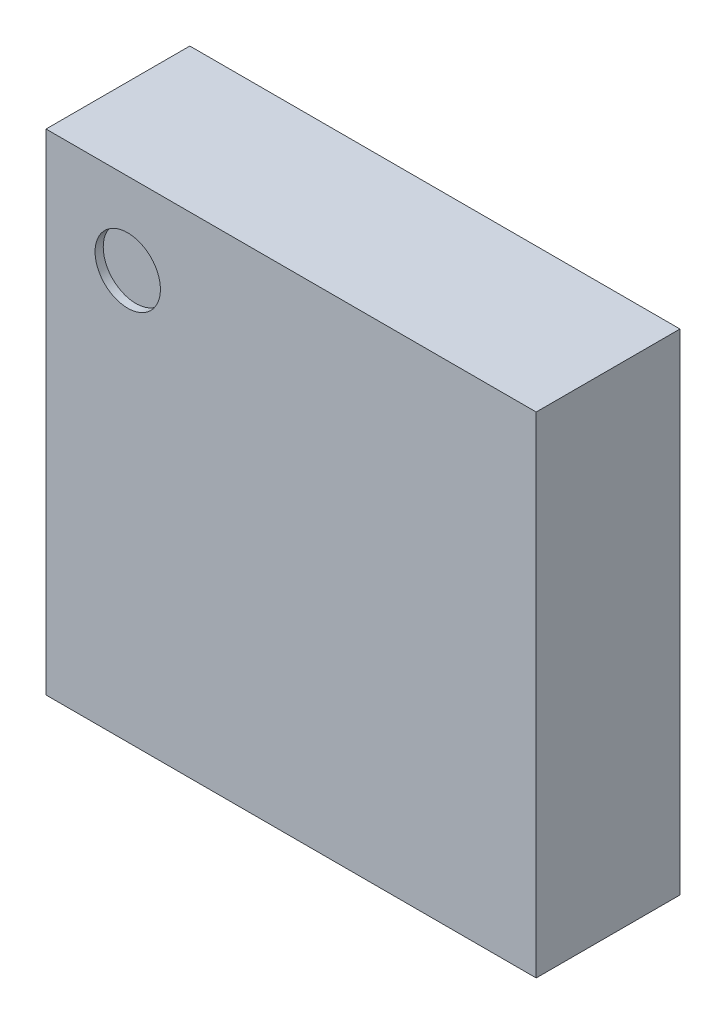
ISO-10303-21;
HEADER;
FILE_DESCRIPTION(('STEP AP214'),'2;1');
FILE_NAME('part.step','',(''),(''),'','','');
FILE_SCHEMA(('AUTOMOTIVE_DESIGN { 1 0 10303 214 1 1 1 1 }'));
ENDSEC;
DATA;
#1=APPLICATION_CONTEXT('core data for automotive mechanical design processes');
#2=APPLICATION_PROTOCOL_DEFINITION('international standard','automotive_design',2000,#1);
#3=PRODUCT_CONTEXT('',#1,'mechanical');
#4=PRODUCT('Part','Part','',(#3));
#5=PRODUCT_RELATED_PRODUCT_CATEGORY('part','',(#4));
#6=PRODUCT_DEFINITION_FORMATION('','',#4);
#7=PRODUCT_DEFINITION_CONTEXT('part definition',#1,'design');
#8=PRODUCT_DEFINITION('design','',#6,#7);
#9=PRODUCT_DEFINITION_SHAPE('','',#8);
#10=(LENGTH_UNIT() NAMED_UNIT(*) SI_UNIT(.MILLI.,.METRE.));
#11=(NAMED_UNIT(*) PLANE_ANGLE_UNIT() SI_UNIT($,.RADIAN.));
#12=(NAMED_UNIT(*) SI_UNIT($,.STERADIAN.) SOLID_ANGLE_UNIT());
#13=UNCERTAINTY_MEASURE_WITH_UNIT(LENGTH_MEASURE(1.E-05),#10,'distance_accuracy_value','');
#14=(GEOMETRIC_REPRESENTATION_CONTEXT(3) GLOBAL_UNCERTAINTY_ASSIGNED_CONTEXT((#13)) GLOBAL_UNIT_ASSIGNED_CONTEXT((#10,
#11,#12)) REPRESENTATION_CONTEXT('',''));
#15=CARTESIAN_POINT('',(0.,0.,0.));
#16=DIRECTION('',(0.,0.,1.));
#17=DIRECTION('',(1.,0.,0.));
#18=AXIS2_PLACEMENT_3D('',#15,#16,#17);
#19=CARTESIAN_POINT('',(-1.02832069959543,1.,0.850000000000001));
#20=DIRECTION('',(0.,0.,1.));
#21=DIRECTION('',(1.,0.,0.));
#22=AXIS2_PLACEMENT_3D('',#19,#20,#21);
#23=PLANE('',#22);
#24=CARTESIAN_POINT('',(-1.02832069959543,1.,0.850000000000001));
#25=DIRECTION('',(0.,0.,-1.));
#26=DIRECTION('',(-1.,0.,0.));
#27=AXIS2_PLACEMENT_3D('',#24,#25,#26);
#28=CIRCLE('',#27,0.2);
#29=CARTESIAN_POINT('',(-1.22832069959544,1.,0.850000000000001));
#30=VERTEX_POINT('',#29);
#31=EDGE_CURVE('E20',#30,#30,#28,.F.);
#32=ORIENTED_EDGE('',*,*,#31,.T.);
#33=EDGE_LOOP('',(#32));
#34=FACE_BOUND('',#33,.T.);
#35=ADVANCED_FACE('F17',(#34),#23,.T.);
#36=CARTESIAN_POINT('',(-1.02832069959543,1.,0.850000000000001));
#37=DIRECTION('',(0.,0.,-1.));
#38=DIRECTION('',(-1.,0.,0.));
#39=AXIS2_PLACEMENT_3D('',#36,#37,#38);
#40=CYLINDRICAL_SURFACE('',#39,0.2);
#41=ORIENTED_EDGE('',*,*,#31,.F.);
#42=EDGE_LOOP('',(#41));
#43=FACE_BOUND('',#42,.T.);
#44=CARTESIAN_POINT('',(-1.02832069959543,1.,0.899999999999999));
#45=DIRECTION('',(0.,0.,-1.));
#46=DIRECTION('',(-1.,0.,0.));
#47=AXIS2_PLACEMENT_3D('',#44,#45,#46);
#48=CIRCLE('',#47,0.2);
#49=CARTESIAN_POINT('',(-1.22832069959544,1.,0.899999999999999));
#50=VERTEX_POINT('',#49);
#51=EDGE_CURVE('E73',#50,#50,#48,.T.);
#52=ORIENTED_EDGE('',*,*,#51,.F.);
#53=EDGE_LOOP('',(#52));
#54=FACE_BOUND('',#53,.T.);
#55=ADVANCED_FACE('F89',(#43,#54),#40,.F.);
#56=CARTESIAN_POINT('',(1.47167930040456,-1.5,0.899999999999999));
#57=DIRECTION('',(0.,0.,1.));
#58=DIRECTION('',(1.,0.,0.));
#59=AXIS2_PLACEMENT_3D('',#56,#57,#58);
#60=PLANE('',#59);
#61=ORIENTED_EDGE('',*,*,#51,.T.);
#62=EDGE_LOOP('',(#61));
#63=FACE_BOUND('',#62,.T.);
#64=DIRECTION('',(1.,0.,0.));
#65=VECTOR('',#64,1.);
#66=CARTESIAN_POINT('',(-0.028320699595436,-1.5,0.899999999999999));
#67=LINE('',#66,#65);
#68=CARTESIAN_POINT('',(-1.52832069959544,-1.5,0.899999999999999));
#69=VERTEX_POINT('',#68);
#70=CARTESIAN_POINT('',(1.47167930040456,-1.5,0.899999999999999));
#71=VERTEX_POINT('',#70);
#72=EDGE_CURVE('E79',#69,#71,#67,.T.);
#73=ORIENTED_EDGE('',*,*,#72,.T.);
#74=DIRECTION('',(0.,-1.,0.));
#75=VECTOR('',#74,1.);
#76=CARTESIAN_POINT('',(1.47167930040456,0.,0.899999999999999));
#77=LINE('',#76,#75);
#78=CARTESIAN_POINT('',(1.47167930040456,1.5,0.899999999999999));
#79=VERTEX_POINT('',#78);
#80=EDGE_CURVE('E69',#71,#79,#77,.F.);
#81=ORIENTED_EDGE('',*,*,#80,.T.);
#82=DIRECTION('',(1.,0.,0.));
#83=VECTOR('',#82,1.);
#84=CARTESIAN_POINT('',(-0.0283206995954357,1.5,0.899999999999999));
#85=LINE('',#84,#83);
#86=CARTESIAN_POINT('',(-1.52832069959544,1.5,0.899999999999999));
#87=VERTEX_POINT('',#86);
#88=EDGE_CURVE('E65',#87,#79,#85,.T.);
#89=ORIENTED_EDGE('',*,*,#88,.F.);
#90=DIRECTION('',(0.,-1.,0.));
#91=VECTOR('',#90,1.);
#92=CARTESIAN_POINT('',(-1.52832069959544,0.,0.899999999999999));
#93=LINE('',#92,#91);
#94=EDGE_CURVE('E55',#69,#87,#93,.F.);
#95=ORIENTED_EDGE('',*,*,#94,.F.);
#96=EDGE_LOOP('',(#73,#81,#89,#95));
#97=FACE_BOUND('',#96,.T.);
#98=ADVANCED_FACE('F68',(#63,#97),#60,.T.);
#99=CARTESIAN_POINT('',(-0.0283206995954357,1.5,0.238538731150911));
#100=DIRECTION('',(0.,1.,0.));
#101=DIRECTION('',(0.,0.,1.));
#102=AXIS2_PLACEMENT_3D('',#99,#100,#101);
#103=PLANE('',#102);
#104=DIRECTION('',(0.,0.,1.));
#105=VECTOR('',#104,1.);
#106=CARTESIAN_POINT('',(1.47167930040456,1.5,0.238538731150911));
#107=LINE('',#106,#105);
#108=CARTESIAN_POINT('',(1.47167930040456,1.5,0.02));
#109=VERTEX_POINT('',#108);
#110=EDGE_CURVE('E212',#79,#109,#107,.F.);
#111=ORIENTED_EDGE('',*,*,#110,.T.);
#112=DIRECTION('',(1.,0.,0.));
#113=VECTOR('',#112,1.);
#114=CARTESIAN_POINT('',(-0.028320699595436,1.5,0.02));
#115=LINE('',#114,#113);
#116=CARTESIAN_POINT('',(-1.52832069959544,1.5,0.02));
#117=VERTEX_POINT('',#116);
#118=EDGE_CURVE('E77',#109,#117,#115,.F.);
#119=ORIENTED_EDGE('',*,*,#118,.T.);
#120=DIRECTION('',(0.,0.,1.));
#121=VECTOR('',#120,1.);
#122=CARTESIAN_POINT('',(-1.52832069959544,1.5,0.238538731150911));
#123=LINE('',#122,#121);
#124=EDGE_CURVE('E62',#87,#117,#123,.F.);
#125=ORIENTED_EDGE('',*,*,#124,.F.);
#126=ORIENTED_EDGE('',*,*,#88,.T.);
#127=EDGE_LOOP('',(#111,#119,#125,#126));
#128=FACE_BOUND('',#127,.T.);
#129=ADVANCED_FACE('F76',(#128),#103,.T.);
#130=CARTESIAN_POINT('',(-1.52832069959544,0.,0.238538731150911));
#131=DIRECTION('',(-1.,0.,0.));
#132=DIRECTION('',(0.,-1.,0.));
#133=AXIS2_PLACEMENT_3D('',#130,#131,#132);
#134=PLANE('',#133);
#135=ORIENTED_EDGE('',*,*,#124,.T.);
#136=DIRECTION('',(0.,-1.,0.));
#137=VECTOR('',#136,1.);
#138=CARTESIAN_POINT('',(-1.52832069959544,0.,0.02));
#139=LINE('',#138,#137);
#140=CARTESIAN_POINT('',(-1.52832069959544,-1.5,0.02));
#141=VERTEX_POINT('',#140);
#142=EDGE_CURVE('E217',#117,#141,#139,.T.);
#143=ORIENTED_EDGE('',*,*,#142,.T.);
#144=DIRECTION('',(0.,0.,1.));
#145=VECTOR('',#144,1.);
#146=CARTESIAN_POINT('',(-1.52832069959544,-1.5,0.238538731150911));
#147=LINE('',#146,#145);
#148=EDGE_CURVE('E64',#141,#69,#147,.T.);
#149=ORIENTED_EDGE('',*,*,#148,.T.);
#150=ORIENTED_EDGE('',*,*,#94,.T.);
#151=EDGE_LOOP('',(#135,#143,#149,#150));
#152=FACE_BOUND('',#151,.T.);
#153=ADVANCED_FACE('F59',(#152),#134,.T.);
#154=CARTESIAN_POINT('',(-0.028320699595436,-1.5,0.238538731150911));
#155=DIRECTION('',(0.,1.,0.));
#156=DIRECTION('',(0.,0.,1.));
#157=AXIS2_PLACEMENT_3D('',#154,#155,#156);
#158=PLANE('',#157);
#159=DIRECTION('',(0.,0.,1.));
#160=VECTOR('',#159,1.);
#161=CARTESIAN_POINT('',(1.47167930040456,-1.5,0.238538731150911));
#162=LINE('',#161,#160);
#163=CARTESIAN_POINT('',(1.47167930040456,-1.5,0.02));
#164=VERTEX_POINT('',#163);
#165=EDGE_CURVE('E34',#164,#71,#162,.T.);
#166=ORIENTED_EDGE('',*,*,#165,.T.);
#167=ORIENTED_EDGE('',*,*,#72,.F.);
#168=ORIENTED_EDGE('',*,*,#148,.F.);
#169=DIRECTION('',(1.,0.,0.));
#170=VECTOR('',#169,1.);
#171=CARTESIAN_POINT('',(-0.028320699595436,-1.5,0.02));
#172=LINE('',#171,#170);
#173=EDGE_CURVE('E26',#141,#164,#172,.T.);
#174=ORIENTED_EDGE('',*,*,#173,.T.);
#175=EDGE_LOOP('',(#166,#167,#168,#174));
#176=FACE_BOUND('',#175,.T.);
#177=ADVANCED_FACE('F106',(#176),#158,.F.);
#178=CARTESIAN_POINT('',(1.47167930040456,0.,0.238538731150911));
#179=DIRECTION('',(-1.,0.,0.));
#180=DIRECTION('',(0.,-1.,0.));
#181=AXIS2_PLACEMENT_3D('',#178,#179,#180);
#182=PLANE('',#181);
#183=ORIENTED_EDGE('',*,*,#110,.F.);
#184=ORIENTED_EDGE('',*,*,#80,.F.);
#185=ORIENTED_EDGE('',*,*,#165,.F.);
#186=DIRECTION('',(0.,-1.,0.));
#187=VECTOR('',#186,1.);
#188=CARTESIAN_POINT('',(1.47167930040456,0.,0.02));
#189=LINE('',#188,#187);
#190=EDGE_CURVE('E11',#164,#109,#189,.F.);
#191=ORIENTED_EDGE('',*,*,#190,.T.);
#192=EDGE_LOOP('',(#183,#184,#185,#191));
#193=FACE_BOUND('',#192,.T.);
#194=ADVANCED_FACE('F100',(#193),#182,.F.);
#195=CARTESIAN_POINT('',(-0.028320699595436,0.,0.02));
#196=DIRECTION('',(0.,0.,1.));
#197=DIRECTION('',(0.,-1.,0.));
#198=AXIS2_PLACEMENT_3D('',#195,#196,#197);
#199=PLANE('',#198);
#200=ORIENTED_EDGE('',*,*,#173,.F.);
#201=ORIENTED_EDGE('',*,*,#142,.F.);
#202=ORIENTED_EDGE('',*,*,#118,.F.);
#203=ORIENTED_EDGE('',*,*,#190,.F.);
#204=EDGE_LOOP('',(#200,#201,#202,#203));
#205=FACE_BOUND('',#204,.T.);
#206=ADVANCED_FACE('F98',(#205),#199,.F.);
#207=CLOSED_SHELL('',(#35,#55,#98,#129,#153,#177,#194,#206));
#208=MANIFOLD_SOLID_BREP('B1',#207);
#209=ADVANCED_BREP_SHAPE_REPRESENTATION('',(#18,#208),#14);
#210=SHAPE_DEFINITION_REPRESENTATION(#9,#209);
ENDSEC;
END-ISO-10303-21;
